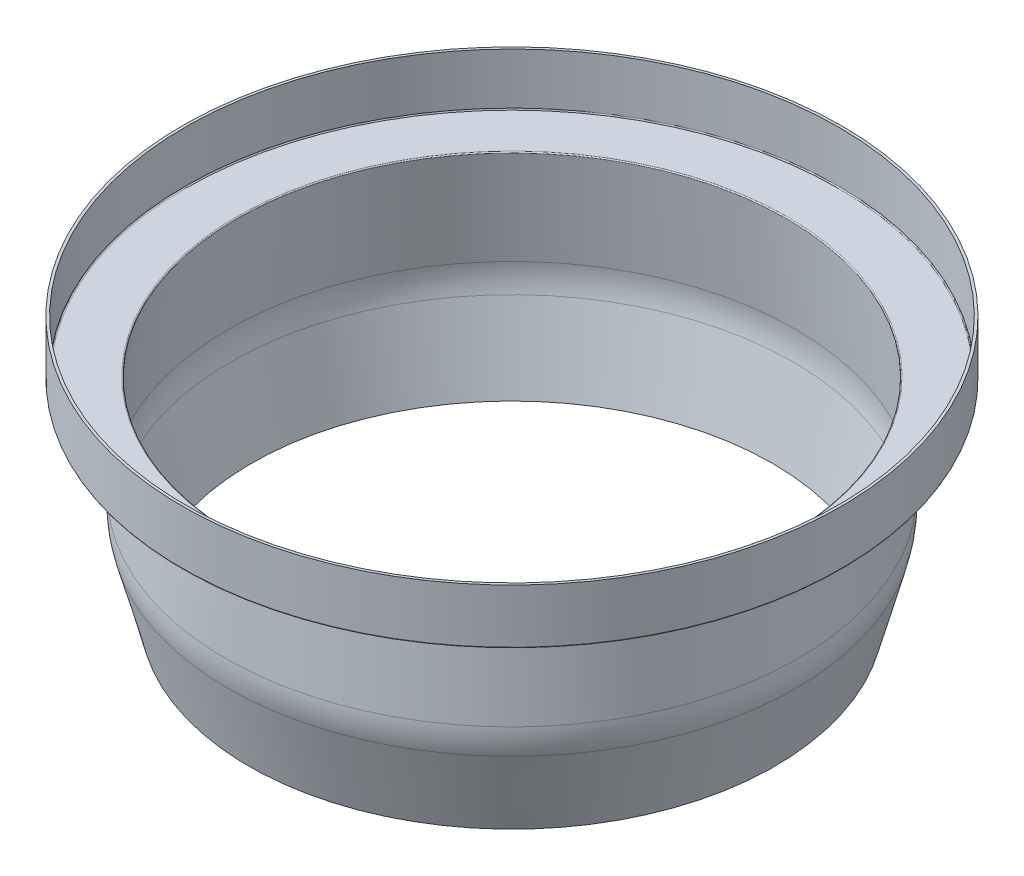
ISO-10303-21;
HEADER;
FILE_DESCRIPTION(('STEP AP214'),'2;1');
FILE_NAME('part.step','',(''),(''),'','','');
FILE_SCHEMA(('AUTOMOTIVE_DESIGN { 1 0 10303 214 1 1 1 1 }'));
ENDSEC;
DATA;
#1=APPLICATION_CONTEXT('core data for automotive mechanical design processes');
#2=APPLICATION_PROTOCOL_DEFINITION('international standard','automotive_design',2000,#1);
#3=PRODUCT_CONTEXT('',#1,'mechanical');
#4=PRODUCT('Part','Part','',(#3));
#5=PRODUCT_RELATED_PRODUCT_CATEGORY('part','',(#4));
#6=PRODUCT_DEFINITION_FORMATION('','',#4);
#7=PRODUCT_DEFINITION_CONTEXT('part definition',#1,'design');
#8=PRODUCT_DEFINITION('design','',#6,#7);
#9=PRODUCT_DEFINITION_SHAPE('','',#8);
#10=(LENGTH_UNIT() NAMED_UNIT(*) SI_UNIT(.MILLI.,.METRE.));
#11=(NAMED_UNIT(*) PLANE_ANGLE_UNIT() SI_UNIT($,.RADIAN.));
#12=(NAMED_UNIT(*) SI_UNIT($,.STERADIAN.) SOLID_ANGLE_UNIT());
#13=UNCERTAINTY_MEASURE_WITH_UNIT(LENGTH_MEASURE(1.E-05),#10,'distance_accuracy_value','');
#14=(GEOMETRIC_REPRESENTATION_CONTEXT(3) GLOBAL_UNCERTAINTY_ASSIGNED_CONTEXT((#13)) GLOBAL_UNIT_ASSIGNED_CONTEXT((#10,
#11,#12)) REPRESENTATION_CONTEXT('',''));
#15=CARTESIAN_POINT('',(0.,0.,0.));
#16=DIRECTION('',(0.,0.,1.));
#17=DIRECTION('',(1.,0.,0.));
#18=AXIS2_PLACEMENT_3D('',#15,#16,#17);
#19=CARTESIAN_POINT('',(-63.1248860517471,17.4323529411765,0.));
#20=DIRECTION('',(0.,1.,0.));
#21=DIRECTION('',(0.,0.,1.));
#22=AXIS2_PLACEMENT_3D('',#19,#20,#21);
#23=PLANE('',#22);
#24=CARTESIAN_POINT('',(0.,17.4323529411765,0.));
#25=DIRECTION('',(0.,-1.,0.));
#26=DIRECTION('',(0.,0.,-1.));
#27=AXIS2_PLACEMENT_3D('',#24,#25,#26);
#28=CIRCLE('',#27,62.6248860517471);
#29=CARTESIAN_POINT('',(0.,17.4323529411765,-62.6248860517471));
#30=VERTEX_POINT('',#29);
#31=EDGE_CURVE('E10',#30,#30,#28,.T.);
#32=ORIENTED_EDGE('',*,*,#31,.T.);
#33=EDGE_LOOP('',(#32));
#34=FACE_BOUND('',#33,.T.);
#35=CARTESIAN_POINT('',(0.,17.4323529411765,0.));
#36=DIRECTION('',(0.,-1.,0.));
#37=DIRECTION('',(0.,0.,-1.));
#38=AXIS2_PLACEMENT_3D('',#35,#36,#37);
#39=CIRCLE('',#38,63.1248860517471);
#40=CARTESIAN_POINT('',(0.,17.4323529411765,-63.1248860517471));
#41=VERTEX_POINT('',#40);
#42=EDGE_CURVE('E85',#41,#41,#39,.T.);
#43=ORIENTED_EDGE('',*,*,#42,.F.);
#44=EDGE_LOOP('',(#43));
#45=FACE_BOUND('',#44,.T.);
#46=ADVANCED_FACE('F33',(#34,#45),#23,.T.);
#47=CARTESIAN_POINT('',(0.,0.,0.));
#48=DIRECTION('',(0.,-1.,0.));
#49=DIRECTION('',(0.,0.,-1.));
#50=AXIS2_PLACEMENT_3D('',#47,#48,#49);
#51=CYLINDRICAL_SURFACE('',#50,62.6248860517471);
#52=CARTESIAN_POINT('',(0.,7.63235294117646,0.));
#53=DIRECTION('',(0.,-1.,0.));
#54=DIRECTION('',(0.,0.,-1.));
#55=AXIS2_PLACEMENT_3D('',#52,#53,#54);
#56=CIRCLE('',#55,62.6248860517471);
#57=CARTESIAN_POINT('',(0.,7.63235294117646,-62.6248860517471));
#58=VERTEX_POINT('',#57);
#59=EDGE_CURVE('E39',#58,#58,#56,.T.);
#60=ORIENTED_EDGE('',*,*,#59,.T.);
#61=EDGE_LOOP('',(#60));
#62=FACE_BOUND('',#61,.T.);
#63=ORIENTED_EDGE('',*,*,#31,.F.);
#64=EDGE_LOOP('',(#63));
#65=FACE_BOUND('',#64,.T.);
#66=ADVANCED_FACE('F92',(#62,#65),#51,.F.);
#67=CARTESIAN_POINT('',(0.,7.63235294117646,0.));
#68=DIRECTION('',(0.,-1.,0.));
#69=DIRECTION('',(0.,0.,-1.));
#70=AXIS2_PLACEMENT_3D('',#67,#68,#69);
#71=TOROIDAL_SURFACE('',#70,62.4248860517471,0.199999999999999);
#72=ORIENTED_EDGE('',*,*,#59,.F.);
#73=EDGE_LOOP('',(#72));
#74=FACE_BOUND('',#73,.T.);
#75=CARTESIAN_POINT('',(0.,7.43235294117646,0.));
#76=DIRECTION('',(0.,-1.,0.));
#77=DIRECTION('',(0.,0.,-1.));
#78=AXIS2_PLACEMENT_3D('',#75,#76,#77);
#79=CIRCLE('',#78,62.4248860517471);
#80=CARTESIAN_POINT('',(0.,7.43235294117646,-62.4248860517471));
#81=VERTEX_POINT('',#80);
#82=EDGE_CURVE('E43',#81,#81,#79,.T.);
#83=ORIENTED_EDGE('',*,*,#82,.T.);
#84=EDGE_LOOP('',(#83));
#85=FACE_BOUND('',#84,.T.);
#86=ADVANCED_FACE('F96',(#74,#85),#71,.F.);
#87=CARTESIAN_POINT('',(-62.4248860517471,7.43235294117646,0.));
#88=DIRECTION('',(0.,1.,0.));
#89=DIRECTION('',(0.,0.,1.));
#90=AXIS2_PLACEMENT_3D('',#87,#88,#89);
#91=PLANE('',#90);
#92=CARTESIAN_POINT('',(0.,7.43235294117646,0.));
#93=DIRECTION('',(0.,-1.,0.));
#94=DIRECTION('',(0.,0.,-1.));
#95=AXIS2_PLACEMENT_3D('',#92,#93,#94);
#96=CIRCLE('',#95,52.8431477519609);
#97=CARTESIAN_POINT('',(0.,7.43235294117646,-52.8431477519609));
#98=VERTEX_POINT('',#97);
#99=EDGE_CURVE('E47',#98,#98,#96,.T.);
#100=ORIENTED_EDGE('',*,*,#99,.T.);
#101=EDGE_LOOP('',(#100));
#102=FACE_BOUND('',#101,.T.);
#103=ORIENTED_EDGE('',*,*,#82,.F.);
#104=EDGE_LOOP('',(#103));
#105=FACE_BOUND('',#104,.T.);
#106=ADVANCED_FACE('F100',(#102,#105),#91,.T.);
#107=CARTESIAN_POINT('',(0.,7.23235294117646,0.));
#108=DIRECTION('',(0.,-1.,0.));
#109=DIRECTION('',(0.,0.,-1.));
#110=AXIS2_PLACEMENT_3D('',#107,#108,#109);
#111=TOROIDAL_SURFACE('',#110,52.8431477519609,0.200000000000002);
#112=CARTESIAN_POINT('',(0.,7.21492179262693,0.));
#113=DIRECTION('',(0.,-1.,0.));
#114=DIRECTION('',(0.,0.,-1.));
#115=AXIS2_PLACEMENT_3D('',#112,#113,#114);
#116=CIRCLE('',#115,52.6439088123426);
#117=CARTESIAN_POINT('',(0.,7.21492179262693,-52.6439088123426));
#118=VERTEX_POINT('',#117);
#119=EDGE_CURVE('E52',#118,#118,#116,.T.);
#120=ORIENTED_EDGE('',*,*,#119,.T.);
#121=EDGE_LOOP('',(#120));
#122=FACE_BOUND('',#121,.T.);
#123=ORIENTED_EDGE('',*,*,#99,.F.);
#124=EDGE_LOOP('',(#123));
#125=FACE_BOUND('',#124,.T.);
#126=ADVANCED_FACE('F107',(#122,#125),#111,.T.);
#127=CARTESIAN_POINT('',(0.,7.21492179262693,0.));
#128=DIRECTION('',(0.,-1.,0.));
#129=DIRECTION('',(0.,0.,-1.));
#130=AXIS2_PLACEMENT_3D('',#127,#128,#129);
#131=CONICAL_SURFACE('',#130,52.6439088123426,0.0872664625997206);
#132=CARTESIAN_POINT('',(0.,-11.932807009139,0.));
#133=DIRECTION('',(0.,-1.,0.));
#134=DIRECTION('',(0.,0.,-1.));
#135=AXIS2_PLACEMENT_3D('',#132,#133,#134);
#136=CIRCLE('',#135,54.319118014766);
#137=CARTESIAN_POINT('',(0.,-11.932807009139,-54.319118014766));
#138=VERTEX_POINT('',#137);
#139=EDGE_CURVE('E55',#138,#138,#136,.T.);
#140=ORIENTED_EDGE('',*,*,#139,.T.);
#141=EDGE_LOOP('',(#140));
#142=FACE_BOUND('',#141,.T.);
#143=ORIENTED_EDGE('',*,*,#119,.F.);
#144=EDGE_LOOP('',(#143));
#145=FACE_BOUND('',#144,.T.);
#146=ADVANCED_FACE('F111',(#142,#145),#131,.F.);
#147=CARTESIAN_POINT('',(0.,-13.240143150354,0.));
#148=DIRECTION('',(0.,-1.,0.));
#149=DIRECTION('',(0.,0.,-1.));
#150=AXIS2_PLACEMENT_3D('',#147,#148,#149);
#151=TOROIDAL_SURFACE('',#150,39.3761975433898,15.);
#152=CARTESIAN_POINT('',(0.,-17.1224288268918,0.));
#153=DIRECTION('',(0.,-1.,0.));
#154=DIRECTION('',(0.,0.,-1.));
#155=AXIS2_PLACEMENT_3D('',#152,#153,#154);
#156=CIRCLE('',#155,53.8650849377258);
#157=CARTESIAN_POINT('',(0.,-17.1224288268918,-53.8650849377258));
#158=VERTEX_POINT('',#157);
#159=EDGE_CURVE('E58',#158,#158,#156,.T.);
#160=ORIENTED_EDGE('',*,*,#159,.T.);
#161=EDGE_LOOP('',(#160));
#162=FACE_BOUND('',#161,.T.);
#163=ORIENTED_EDGE('',*,*,#139,.F.);
#164=EDGE_LOOP('',(#163));
#165=FACE_BOUND('',#164,.T.);
#166=ADVANCED_FACE('F115',(#162,#165),#151,.F.);
#167=CARTESIAN_POINT('',(0.,-17.1224288268918,0.));
#168=DIRECTION('',(0.,1.,0.));
#169=DIRECTION('',(0.,0.,1.));
#170=AXIS2_PLACEMENT_3D('',#167,#168,#169);
#171=CONICAL_SURFACE('',#170,53.8650849377258,0.261799387799147);
#172=CARTESIAN_POINT('',(0.,-31.9543119320268,0.));
#173=DIRECTION('',(0.,-1.,0.));
#174=DIRECTION('',(0.,0.,-1.));
#175=AXIS2_PLACEMENT_3D('',#172,#173,#174);
#176=CIRCLE('',#175,49.8908938374721);
#177=CARTESIAN_POINT('',(0.,-31.9543119320268,-49.8908938374721));
#178=VERTEX_POINT('',#177);
#179=EDGE_CURVE('E61',#178,#178,#176,.T.);
#180=ORIENTED_EDGE('',*,*,#179,.T.);
#181=EDGE_LOOP('',(#180));
#182=FACE_BOUND('',#181,.T.);
#183=ORIENTED_EDGE('',*,*,#159,.F.);
#184=EDGE_LOOP('',(#183));
#185=FACE_BOUND('',#184,.T.);
#186=ADVANCED_FACE('F119',(#182,#185),#171,.F.);
#187=CARTESIAN_POINT('',(0.,-32.083721454578,0.));
#188=DIRECTION('',(0.,-1.,0.));
#189=DIRECTION('',(0.,0.,-1.));
#190=AXIS2_PLACEMENT_3D('',#187,#188,#189);
#191=CONICAL_SURFACE('',#190,50.3738567506167,1.30899693899576);
#192=ORIENTED_EDGE('',*,*,#179,.F.);
#193=EDGE_LOOP('',(#192));
#194=FACE_BOUND('',#193,.T.);
#195=CARTESIAN_POINT('',(0.,-32.083721454578,0.));
#196=DIRECTION('',(0.,-1.,0.));
#197=DIRECTION('',(0.,0.,-1.));
#198=AXIS2_PLACEMENT_3D('',#195,#196,#197);
#199=CIRCLE('',#198,50.3738567506167);
#200=CARTESIAN_POINT('',(0.,-32.083721454578,-50.3738567506167));
#201=VERTEX_POINT('',#200);
#202=EDGE_CURVE('E64',#201,#201,#199,.T.);
#203=ORIENTED_EDGE('',*,*,#202,.T.);
#204=EDGE_LOOP('',(#203));
#205=FACE_BOUND('',#204,.T.);
#206=ADVANCED_FACE('F123',(#194,#205),#191,.F.);
#207=CARTESIAN_POINT('',(0.,-17.1666789571741,0.));
#208=DIRECTION('',(0.,1.,0.));
#209=DIRECTION('',(0.,0.,1.));
#210=AXIS2_PLACEMENT_3D('',#207,#208,#209);
#211=CONICAL_SURFACE('',#210,54.3708662412568,0.261799387799147);
#212=ORIENTED_EDGE('',*,*,#202,.F.);
#213=EDGE_LOOP('',(#212));
#214=FACE_BOUND('',#213,.T.);
#215=CARTESIAN_POINT('',(0.,-17.1666789571741,0.));
#216=DIRECTION('',(0.,-1.,0.));
#217=DIRECTION('',(0.,0.,-1.));
#218=AXIS2_PLACEMENT_3D('',#215,#216,#217);
#219=CIRCLE('',#218,54.3708662412568);
#220=CARTESIAN_POINT('',(0.,-17.1666789571741,-54.3708662412568));
#221=VERTEX_POINT('',#220);
#222=EDGE_CURVE('E67',#221,#221,#219,.T.);
#223=ORIENTED_EDGE('',*,*,#222,.T.);
#224=EDGE_LOOP('',(#223));
#225=FACE_BOUND('',#224,.T.);
#226=ADVANCED_FACE('F127',(#214,#225),#211,.T.);
#227=CARTESIAN_POINT('',(0.,-13.2843932806363,0.));
#228=DIRECTION('',(0.,-1.,0.));
#229=DIRECTION('',(0.,0.,-1.));
#230=AXIS2_PLACEMENT_3D('',#227,#228,#229);
#231=TOROIDAL_SURFACE('',#230,39.8819788469207,15.);
#232=ORIENTED_EDGE('',*,*,#222,.F.);
#233=EDGE_LOOP('',(#232));
#234=FACE_BOUND('',#233,.T.);
#235=CARTESIAN_POINT('',(0.,-11.9770571394213,0.));
#236=DIRECTION('',(0.,-1.,0.));
#237=DIRECTION('',(0.,0.,-1.));
#238=AXIS2_PLACEMENT_3D('',#235,#236,#237);
#239=CIRCLE('',#238,54.8248993182969);
#240=CARTESIAN_POINT('',(0.,-11.9770571394213,-54.8248993182969));
#241=VERTEX_POINT('',#240);
#242=EDGE_CURVE('E70',#241,#241,#239,.T.);
#243=ORIENTED_EDGE('',*,*,#242,.T.);
#244=EDGE_LOOP('',(#243));
#245=FACE_BOUND('',#244,.T.);
#246=ADVANCED_FACE('F131',(#234,#245),#231,.T.);
#247=CARTESIAN_POINT('',(0.,6.71492179262693,0.));
#248=DIRECTION('',(0.,-1.,0.));
#249=DIRECTION('',(0.,0.,-1.));
#250=AXIS2_PLACEMENT_3D('',#247,#248,#249);
#251=CONICAL_SURFACE('',#250,53.1895630628772,0.0872664625997206);
#252=ORIENTED_EDGE('',*,*,#242,.F.);
#253=EDGE_LOOP('',(#252));
#254=FACE_BOUND('',#253,.T.);
#255=CARTESIAN_POINT('',(0.,6.71492179262693,0.));
#256=DIRECTION('',(0.,-1.,0.));
#257=DIRECTION('',(0.,0.,-1.));
#258=AXIS2_PLACEMENT_3D('',#255,#256,#257);
#259=CIRCLE('',#258,53.1895630628772);
#260=CARTESIAN_POINT('',(0.,6.71492179262693,-53.1895630628772));
#261=VERTEX_POINT('',#260);
#262=EDGE_CURVE('E73',#261,#261,#259,.T.);
#263=ORIENTED_EDGE('',*,*,#262,.T.);
#264=EDGE_LOOP('',(#263));
#265=FACE_BOUND('',#264,.T.);
#266=ADVANCED_FACE('F135',(#254,#265),#251,.T.);
#267=CARTESIAN_POINT('',(0.,6.73235294117646,0.));
#268=DIRECTION('',(0.,-1.,0.));
#269=DIRECTION('',(0.,0.,-1.));
#270=AXIS2_PLACEMENT_3D('',#267,#268,#269);
#271=TOROIDAL_SURFACE('',#270,53.3888020024956,0.200000000000002);
#272=ORIENTED_EDGE('',*,*,#262,.F.);
#273=EDGE_LOOP('',(#272));
#274=FACE_BOUND('',#273,.T.);
#275=CARTESIAN_POINT('',(0.,6.93235294117646,0.));
#276=DIRECTION('',(0.,-1.,0.));
#277=DIRECTION('',(0.,0.,-1.));
#278=AXIS2_PLACEMENT_3D('',#275,#276,#277);
#279=CIRCLE('',#278,53.3888020024956);
#280=CARTESIAN_POINT('',(0.,6.93235294117646,-53.3888020024956));
#281=VERTEX_POINT('',#280);
#282=EDGE_CURVE('E76',#281,#281,#279,.T.);
#283=ORIENTED_EDGE('',*,*,#282,.T.);
#284=EDGE_LOOP('',(#283));
#285=FACE_BOUND('',#284,.T.);
#286=ADVANCED_FACE('F139',(#274,#285),#271,.F.);
#287=CARTESIAN_POINT('',(-62.9248860517471,6.93235294117646,0.));
#288=DIRECTION('',(0.,1.,0.));
#289=DIRECTION('',(0.,0.,1.));
#290=AXIS2_PLACEMENT_3D('',#287,#288,#289);
#291=PLANE('',#290);
#292=ORIENTED_EDGE('',*,*,#282,.F.);
#293=EDGE_LOOP('',(#292));
#294=FACE_BOUND('',#293,.T.);
#295=CARTESIAN_POINT('',(0.,6.93235294117646,0.));
#296=DIRECTION('',(0.,-1.,0.));
#297=DIRECTION('',(0.,0.,-1.));
#298=AXIS2_PLACEMENT_3D('',#295,#296,#297);
#299=CIRCLE('',#298,62.9248860517471);
#300=CARTESIAN_POINT('',(0.,6.93235294117646,-62.9248860517471));
#301=VERTEX_POINT('',#300);
#302=EDGE_CURVE('E79',#301,#301,#299,.T.);
#303=ORIENTED_EDGE('',*,*,#302,.T.);
#304=EDGE_LOOP('',(#303));
#305=FACE_BOUND('',#304,.T.);
#306=ADVANCED_FACE('F143',(#294,#305),#291,.F.);
#307=CARTESIAN_POINT('',(0.,7.13235294117646,0.));
#308=DIRECTION('',(0.,-1.,0.));
#309=DIRECTION('',(0.,0.,-1.));
#310=AXIS2_PLACEMENT_3D('',#307,#308,#309);
#311=TOROIDAL_SURFACE('',#310,62.9248860517471,0.200000000000003);
#312=ORIENTED_EDGE('',*,*,#302,.F.);
#313=EDGE_LOOP('',(#312));
#314=FACE_BOUND('',#313,.T.);
#315=CARTESIAN_POINT('',(0.,7.13235294117646,0.));
#316=DIRECTION('',(0.,-1.,0.));
#317=DIRECTION('',(0.,0.,-1.));
#318=AXIS2_PLACEMENT_3D('',#315,#316,#317);
#319=CIRCLE('',#318,63.1248860517471);
#320=CARTESIAN_POINT('',(0.,7.13235294117646,-63.1248860517471));
#321=VERTEX_POINT('',#320);
#322=EDGE_CURVE('E82',#321,#321,#319,.T.);
#323=ORIENTED_EDGE('',*,*,#322,.T.);
#324=EDGE_LOOP('',(#323));
#325=FACE_BOUND('',#324,.T.);
#326=ADVANCED_FACE('F147',(#314,#325),#311,.T.);
#327=CARTESIAN_POINT('',(0.,0.,0.));
#328=DIRECTION('',(0.,-1.,0.));
#329=DIRECTION('',(0.,0.,-1.));
#330=AXIS2_PLACEMENT_3D('',#327,#328,#329);
#331=CYLINDRICAL_SURFACE('',#330,63.1248860517471);
#332=ORIENTED_EDGE('',*,*,#322,.F.);
#333=EDGE_LOOP('',(#332));
#334=FACE_BOUND('',#333,.T.);
#335=ORIENTED_EDGE('',*,*,#42,.T.);
#336=EDGE_LOOP('',(#335));
#337=FACE_BOUND('',#336,.T.);
#338=ADVANCED_FACE('F89',(#334,#337),#331,.T.);
#339=CLOSED_SHELL('',(#46,#66,#86,#106,#126,#146,#166,#186,#206,#226,#246,#266,#286,#306,#326,#338));
#340=MANIFOLD_SOLID_BREP('B2',#339);
#341=ADVANCED_BREP_SHAPE_REPRESENTATION('',(#18,#340),#14);
#342=SHAPE_DEFINITION_REPRESENTATION(#9,#341);
ENDSEC;
END-ISO-10303-21;
